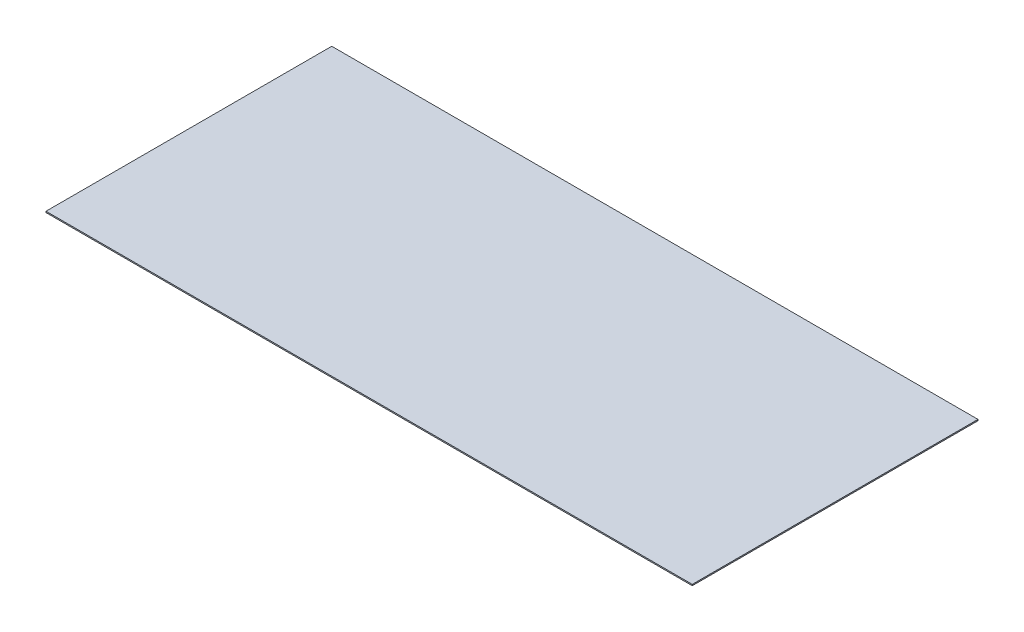
ISO-10303-21;
HEADER;
FILE_DESCRIPTION(('STEP AP214'),'2;1');
FILE_NAME('part.step','',(''),(''),'','','');
FILE_SCHEMA(('AUTOMOTIVE_DESIGN { 1 0 10303 214 1 1 1 1 }'));
ENDSEC;
DATA;
#1=APPLICATION_CONTEXT('core data for automotive mechanical design processes');
#2=APPLICATION_PROTOCOL_DEFINITION('international standard','automotive_design',2000,#1);
#3=PRODUCT_CONTEXT('',#1,'mechanical');
#4=PRODUCT('Part','Part','',(#3));
#5=PRODUCT_RELATED_PRODUCT_CATEGORY('part','',(#4));
#6=PRODUCT_DEFINITION_FORMATION('','',#4);
#7=PRODUCT_DEFINITION_CONTEXT('part definition',#1,'design');
#8=PRODUCT_DEFINITION('design','',#6,#7);
#9=PRODUCT_DEFINITION_SHAPE('','',#8);
#10=(LENGTH_UNIT() NAMED_UNIT(*) SI_UNIT(.MILLI.,.METRE.));
#11=(NAMED_UNIT(*) PLANE_ANGLE_UNIT() SI_UNIT($,.RADIAN.));
#12=(NAMED_UNIT(*) SI_UNIT($,.STERADIAN.) SOLID_ANGLE_UNIT());
#13=UNCERTAINTY_MEASURE_WITH_UNIT(LENGTH_MEASURE(1.E-05),#10,'distance_accuracy_value','');
#14=(GEOMETRIC_REPRESENTATION_CONTEXT(3) GLOBAL_UNCERTAINTY_ASSIGNED_CONTEXT((#13)) GLOBAL_UNIT_ASSIGNED_CONTEXT((#10,
#11,#12)) REPRESENTATION_CONTEXT('',''));
#15=CARTESIAN_POINT('',(0.,0.,0.));
#16=DIRECTION('',(0.,0.,1.));
#17=DIRECTION('',(1.,0.,0.));
#18=AXIS2_PLACEMENT_3D('',#15,#16,#17);
#19=CARTESIAN_POINT('',(-842.5,3.175,372.5));
#20=DIRECTION('',(1.,0.,0.));
#21=DIRECTION('',(0.,0.,-1.));
#22=AXIS2_PLACEMENT_3D('',#19,#20,#21);
#23=PLANE('',#22);
#24=DIRECTION('',(0.,0.,1.));
#25=VECTOR('',#24,1.);
#26=CARTESIAN_POINT('',(-842.5,0.,372.5));
#27=LINE('',#26,#25);
#28=CARTESIAN_POINT('',(-842.5,0.,-372.5));
#29=VERTEX_POINT('',#28);
#30=CARTESIAN_POINT('',(-842.5,0.,372.5));
#31=VERTEX_POINT('',#30);
#32=EDGE_CURVE('E111',#29,#31,#27,.T.);
#33=ORIENTED_EDGE('',*,*,#32,.T.);
#34=DIRECTION('',(0.,-1.,0.));
#35=VECTOR('',#34,1.);
#36=CARTESIAN_POINT('',(-842.5,3.175,372.5));
#37=LINE('',#36,#35);
#38=CARTESIAN_POINT('',(-842.5,3.175,372.5));
#39=VERTEX_POINT('',#38);
#40=EDGE_CURVE('E11',#39,#31,#37,.T.);
#41=ORIENTED_EDGE('',*,*,#40,.F.);
#42=DIRECTION('',(0.,0.,1.));
#43=VECTOR('',#42,1.);
#44=CARTESIAN_POINT('',(-842.5,3.175,372.5));
#45=LINE('',#44,#43);
#46=CARTESIAN_POINT('',(-842.5,3.175,-372.5));
#47=VERTEX_POINT('',#46);
#48=EDGE_CURVE('E95',#47,#39,#45,.T.);
#49=ORIENTED_EDGE('',*,*,#48,.F.);
#50=DIRECTION('',(0.,-1.,0.));
#51=VECTOR('',#50,1.);
#52=CARTESIAN_POINT('',(-842.5,3.175,-372.5));
#53=LINE('',#52,#51);
#54=EDGE_CURVE('E107',#47,#29,#53,.T.);
#55=ORIENTED_EDGE('',*,*,#54,.T.);
#56=EDGE_LOOP('',(#33,#41,#49,#55));
#57=FACE_BOUND('',#56,.T.);
#58=ADVANCED_FACE('F43',(#57),#23,.F.);
#59=CARTESIAN_POINT('',(842.5,3.175,372.5));
#60=DIRECTION('',(0.,0.,-1.));
#61=DIRECTION('',(-1.,0.,0.));
#62=AXIS2_PLACEMENT_3D('',#59,#60,#61);
#63=PLANE('',#62);
#64=DIRECTION('',(1.,0.,0.));
#65=VECTOR('',#64,1.);
#66=CARTESIAN_POINT('',(842.5,0.,372.5));
#67=LINE('',#66,#65);
#68=CARTESIAN_POINT('',(842.5,0.,372.5));
#69=VERTEX_POINT('',#68);
#70=EDGE_CURVE('E100',#31,#69,#67,.T.);
#71=ORIENTED_EDGE('',*,*,#70,.T.);
#72=DIRECTION('',(0.,-1.,0.));
#73=VECTOR('',#72,1.);
#74=CARTESIAN_POINT('',(842.5,3.175,372.5));
#75=LINE('',#74,#73);
#76=CARTESIAN_POINT('',(842.5,3.175,372.5));
#77=VERTEX_POINT('',#76);
#78=EDGE_CURVE('E52',#77,#69,#75,.T.);
#79=ORIENTED_EDGE('',*,*,#78,.F.);
#80=DIRECTION('',(1.,0.,0.));
#81=VECTOR('',#80,1.);
#82=CARTESIAN_POINT('',(842.5,3.175,372.5));
#83=LINE('',#82,#81);
#84=EDGE_CURVE('E90',#39,#77,#83,.T.);
#85=ORIENTED_EDGE('',*,*,#84,.F.);
#86=ORIENTED_EDGE('',*,*,#40,.T.);
#87=EDGE_LOOP('',(#71,#79,#85,#86));
#88=FACE_BOUND('',#87,.T.);
#89=ADVANCED_FACE('F99',(#88),#63,.F.);
#90=CARTESIAN_POINT('',(842.5,3.175,372.5));
#91=DIRECTION('',(-1.,0.,0.));
#92=DIRECTION('',(0.,0.,1.));
#93=AXIS2_PLACEMENT_3D('',#90,#91,#92);
#94=PLANE('',#93);
#95=DIRECTION('',(0.,0.,-1.));
#96=VECTOR('',#95,1.);
#97=CARTESIAN_POINT('',(842.5,0.,372.5));
#98=LINE('',#97,#96);
#99=CARTESIAN_POINT('',(842.5,0.,-372.5));
#100=VERTEX_POINT('',#99);
#101=EDGE_CURVE('E77',#69,#100,#98,.T.);
#102=ORIENTED_EDGE('',*,*,#101,.T.);
#103=DIRECTION('',(0.,-1.,0.));
#104=VECTOR('',#103,1.);
#105=CARTESIAN_POINT('',(842.5,3.175,-372.5));
#106=LINE('',#105,#104);
#107=CARTESIAN_POINT('',(842.5,3.175,-372.5));
#108=VERTEX_POINT('',#107);
#109=EDGE_CURVE('E102',#108,#100,#106,.T.);
#110=ORIENTED_EDGE('',*,*,#109,.F.);
#111=DIRECTION('',(0.,0.,-1.));
#112=VECTOR('',#111,1.);
#113=CARTESIAN_POINT('',(842.5,3.175,372.5));
#114=LINE('',#113,#112);
#115=EDGE_CURVE('E93',#77,#108,#114,.T.);
#116=ORIENTED_EDGE('',*,*,#115,.F.);
#117=ORIENTED_EDGE('',*,*,#78,.T.);
#118=EDGE_LOOP('',(#102,#110,#116,#117));
#119=FACE_BOUND('',#118,.T.);
#120=ADVANCED_FACE('F103',(#119),#94,.F.);
#121=CARTESIAN_POINT('',(842.5,3.175,-372.5));
#122=DIRECTION('',(0.,0.,1.));
#123=DIRECTION('',(1.,0.,0.));
#124=AXIS2_PLACEMENT_3D('',#121,#122,#123);
#125=PLANE('',#124);
#126=DIRECTION('',(-1.,0.,0.));
#127=VECTOR('',#126,1.);
#128=CARTESIAN_POINT('',(842.5,0.,-372.5));
#129=LINE('',#128,#127);
#130=EDGE_CURVE('E83',#100,#29,#129,.T.);
#131=ORIENTED_EDGE('',*,*,#130,.T.);
#132=ORIENTED_EDGE('',*,*,#54,.F.);
#133=DIRECTION('',(-1.,0.,0.));
#134=VECTOR('',#133,1.);
#135=CARTESIAN_POINT('',(842.5,3.175,-372.5));
#136=LINE('',#135,#134);
#137=EDGE_CURVE('E60',#108,#47,#136,.T.);
#138=ORIENTED_EDGE('',*,*,#137,.F.);
#139=ORIENTED_EDGE('',*,*,#109,.T.);
#140=EDGE_LOOP('',(#131,#132,#138,#139));
#141=FACE_BOUND('',#140,.T.);
#142=ADVANCED_FACE('F124',(#141),#125,.F.);
#143=CARTESIAN_POINT('',(0.,3.175,0.));
#144=DIRECTION('',(0.,1.,0.));
#145=DIRECTION('',(0.,0.,1.));
#146=AXIS2_PLACEMENT_3D('',#143,#144,#145);
#147=PLANE('',#146);
#148=ORIENTED_EDGE('',*,*,#48,.T.);
#149=ORIENTED_EDGE('',*,*,#84,.T.);
#150=ORIENTED_EDGE('',*,*,#115,.T.);
#151=ORIENTED_EDGE('',*,*,#137,.T.);
#152=EDGE_LOOP('',(#148,#149,#150,#151));
#153=FACE_BOUND('',#152,.T.);
#154=ADVANCED_FACE('F91',(#153),#147,.T.);
#155=CARTESIAN_POINT('',(0.,0.,0.));
#156=DIRECTION('',(0.,1.,0.));
#157=DIRECTION('',(0.,0.,1.));
#158=AXIS2_PLACEMENT_3D('',#155,#156,#157);
#159=PLANE('',#158);
#160=ORIENTED_EDGE('',*,*,#32,.F.);
#161=ORIENTED_EDGE('',*,*,#130,.F.);
#162=ORIENTED_EDGE('',*,*,#101,.F.);
#163=ORIENTED_EDGE('',*,*,#70,.F.);
#164=EDGE_LOOP('',(#160,#161,#162,#163));
#165=FACE_BOUND('',#164,.T.);
#166=ADVANCED_FACE('F127',(#165),#159,.F.);
#167=CLOSED_SHELL('',(#58,#89,#120,#142,#154,#166));
#168=MANIFOLD_SOLID_BREP('B2',#167);
#169=ADVANCED_BREP_SHAPE_REPRESENTATION('',(#18,#168),#14);
#170=SHAPE_DEFINITION_REPRESENTATION(#9,#169);
ENDSEC;
END-ISO-10303-21;
